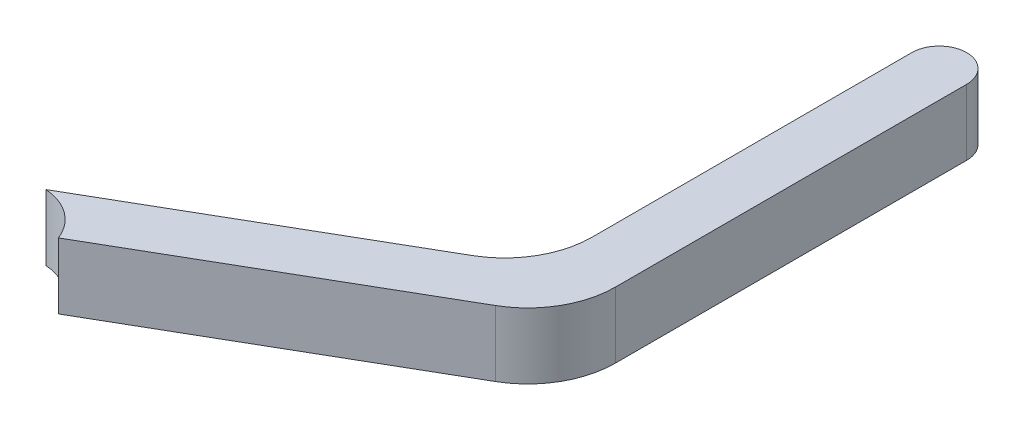
ISO-10303-21;
HEADER;
FILE_DESCRIPTION(('STEP AP214'),'2;1');
FILE_NAME('part.step','',(''),(''),'','','');
FILE_SCHEMA(('AUTOMOTIVE_DESIGN { 1 0 10303 214 1 1 1 1 }'));
ENDSEC;
DATA;
#1=APPLICATION_CONTEXT('core data for automotive mechanical design processes');
#2=APPLICATION_PROTOCOL_DEFINITION('international standard','automotive_design',2000,#1);
#3=PRODUCT_CONTEXT('',#1,'mechanical');
#4=PRODUCT('Part','Part','',(#3));
#5=PRODUCT_RELATED_PRODUCT_CATEGORY('part','',(#4));
#6=PRODUCT_DEFINITION_FORMATION('','',#4);
#7=PRODUCT_DEFINITION_CONTEXT('part definition',#1,'design');
#8=PRODUCT_DEFINITION('design','',#6,#7);
#9=PRODUCT_DEFINITION_SHAPE('','',#8);
#10=(LENGTH_UNIT() NAMED_UNIT(*) SI_UNIT(.MILLI.,.METRE.));
#11=(NAMED_UNIT(*) PLANE_ANGLE_UNIT() SI_UNIT($,.RADIAN.));
#12=(NAMED_UNIT(*) SI_UNIT($,.STERADIAN.) SOLID_ANGLE_UNIT());
#13=UNCERTAINTY_MEASURE_WITH_UNIT(LENGTH_MEASURE(1.E-05),#10,'distance_accuracy_value','');
#14=(GEOMETRIC_REPRESENTATION_CONTEXT(3) GLOBAL_UNCERTAINTY_ASSIGNED_CONTEXT((#13)) GLOBAL_UNIT_ASSIGNED_CONTEXT((#10,
#11,#12)) REPRESENTATION_CONTEXT('',''));
#15=CARTESIAN_POINT('',(0.,0.,0.));
#16=DIRECTION('',(0.,0.,1.));
#17=DIRECTION('',(1.,0.,0.));
#18=AXIS2_PLACEMENT_3D('',#15,#16,#17);
#19=CARTESIAN_POINT('',(-90.8935076670376,19.05,61.6428266425394));
#20=DIRECTION('',(-0.500000000000004,0.,-0.866025403784436));
#21=DIRECTION('',(-0.866025403784436,0.,0.500000000000004));
#22=AXIS2_PLACEMENT_3D('',#19,#20,#21);
#23=PLANE('',#22);
#24=DIRECTION('',(0.866025403784436,0.,-0.500000000000004));
#25=VECTOR('',#24,1.);
#26=CARTESIAN_POINT('',(-90.8935076670376,0.,61.6428266425394));
#27=LINE('',#26,#25);
#28=CARTESIAN_POINT('',(-84.9318322152041,0.,58.2008517156021));
#29=VERTEX_POINT('',#28);
#30=CARTESIAN_POINT('',(-4.76249999999986,0.,11.9150661804009));
#31=VERTEX_POINT('',#30);
#32=EDGE_CURVE('E159',#29,#31,#27,.T.);
#33=ORIENTED_EDGE('',*,*,#32,.T.);
#34=DIRECTION('',(0.,-1.,0.));
#35=VECTOR('',#34,1.);
#36=CARTESIAN_POINT('',(-4.76249999999986,19.05,11.9150661804009));
#37=LINE('',#36,#35);
#38=CARTESIAN_POINT('',(-4.76249999999986,19.05,11.9150661804009));
#39=VERTEX_POINT('',#38);
#40=EDGE_CURVE('E176',#31,#39,#37,.F.);
#41=ORIENTED_EDGE('',*,*,#40,.T.);
#42=DIRECTION('',(0.866025403784436,0.,-0.500000000000004));
#43=VECTOR('',#42,1.);
#44=CARTESIAN_POINT('',(-90.8935076670376,19.05,61.6428266425394));
#45=LINE('',#44,#43);
#46=CARTESIAN_POINT('',(-84.9318322152041,19.05,58.2008517156021));
#47=VERTEX_POINT('',#46);
#48=EDGE_CURVE('E147',#47,#39,#45,.T.);
#49=ORIENTED_EDGE('',*,*,#48,.F.);
#50=DIRECTION('',(0.,1.,0.));
#51=VECTOR('',#50,1.);
#52=CARTESIAN_POINT('',(-84.9318322152041,0.,58.2008517156021));
#53=LINE('',#52,#51);
#54=EDGE_CURVE('E134',#29,#47,#53,.T.);
#55=ORIENTED_EDGE('',*,*,#54,.F.);
#56=EDGE_LOOP('',(#33,#41,#49,#55));
#57=FACE_BOUND('',#56,.T.);
#58=ADVANCED_FACE('F33',(#57),#23,.F.);
#59=CARTESIAN_POINT('',(0.,19.05,-111.6203));
#60=DIRECTION('',(0.,-1.,0.));
#61=DIRECTION('',(0.,0.,-1.));
#62=AXIS2_PLACEMENT_3D('',#59,#60,#61);
#63=PLANE('',#62);
#64=ORIENTED_EDGE('',*,*,#48,.T.);
#65=CARTESIAN_POINT('',(-17.4625,19.05,-10.0819790757238));
#66=DIRECTION('',(0.,-1.,0.));
#67=DIRECTION('',(0.,0.,-1.));
#68=AXIS2_PLACEMENT_3D('',#65,#66,#67);
#69=CIRCLE('',#68,25.4);
#70=CARTESIAN_POINT('',(7.93750000000001,19.05,-10.0819790757238));
#71=VERTEX_POINT('',#70);
#72=EDGE_CURVE('E178',#39,#71,#69,.F.);
#73=ORIENTED_EDGE('',*,*,#72,.T.);
#74=DIRECTION('',(0.,0.,-1.));
#75=VECTOR('',#74,1.);
#76=CARTESIAN_POINT('',(7.9375,19.05,-111.6203));
#77=LINE('',#76,#75);
#78=CARTESIAN_POINT('',(7.9375,19.05,-111.6203));
#79=VERTEX_POINT('',#78);
#80=EDGE_CURVE('E150',#71,#79,#77,.T.);
#81=ORIENTED_EDGE('',*,*,#80,.T.);
#82=CARTESIAN_POINT('',(0.,19.05,-111.6203));
#83=DIRECTION('',(0.,1.,0.));
#84=DIRECTION('',(0.,0.,-1.));
#85=AXIS2_PLACEMENT_3D('',#82,#83,#84);
#86=CIRCLE('',#85,7.9375);
#87=CARTESIAN_POINT('',(-7.9375,19.05,-111.6203));
#88=VERTEX_POINT('',#87);
#89=EDGE_CURVE('E139',#79,#88,#86,.T.);
#90=ORIENTED_EDGE('',*,*,#89,.T.);
#91=DIRECTION('',(0.,0.,1.));
#92=VECTOR('',#91,1.);
#93=CARTESIAN_POINT('',(-7.9375,19.05,-111.6203));
#94=LINE('',#93,#92);
#95=CARTESIAN_POINT('',(-7.9375,19.05,-19.2474145991091));
#96=VERTEX_POINT('',#95);
#97=EDGE_CURVE('E142',#88,#96,#94,.T.);
#98=ORIENTED_EDGE('',*,*,#97,.T.);
#99=CARTESIAN_POINT('',(-33.3375,19.05,-19.2474145991091));
#100=DIRECTION('',(0.,-1.,0.));
#101=DIRECTION('',(0.,0.,-1.));
#102=AXIS2_PLACEMENT_3D('',#99,#100,#101);
#103=CIRCLE('',#102,25.4);
#104=CARTESIAN_POINT('',(-20.6374999999999,19.05,2.74963065701558));
#105=VERTEX_POINT('',#104);
#106=EDGE_CURVE('E11',#96,#105,#103,.T.);
#107=ORIENTED_EDGE('',*,*,#106,.T.);
#108=DIRECTION('',(-0.866025403784436,0.,0.500000000000005));
#109=VECTOR('',#108,1.);
#110=CARTESIAN_POINT('',(-98.8310076670377,19.05,47.8946733574615));
#111=LINE('',#110,#109);
#112=CARTESIAN_POINT('',(-98.8310076670377,19.05,47.8946733574615));
#113=VERTEX_POINT('',#112);
#114=EDGE_CURVE('E145',#105,#113,#111,.T.);
#115=ORIENTED_EDGE('',*,*,#114,.T.);
#116=CARTESIAN_POINT('',(-100.034341800716,19.05,64.0430012597286));
#117=DIRECTION('',(0.,1.,0.));
#118=DIRECTION('',(0.,0.,1.));
#119=AXIS2_PLACEMENT_3D('',#116,#117,#118);
#120=CIRCLE('',#119,16.1931006010712);
#121=EDGE_CURVE('E131',#113,#47,#120,.F.);
#122=ORIENTED_EDGE('',*,*,#121,.T.);
#123=EDGE_LOOP('',(#64,#73,#81,#90,#98,#107,#115,#122));
#124=FACE_BOUND('',#123,.T.);
#125=ADVANCED_FACE('F197',(#124),#63,.F.);
#126=CARTESIAN_POINT('',(0.,0.,-111.6203));
#127=DIRECTION('',(0.,-1.,0.));
#128=DIRECTION('',(0.,0.,-1.));
#129=AXIS2_PLACEMENT_3D('',#126,#127,#128);
#130=PLANE('',#129);
#131=CARTESIAN_POINT('',(0.,0.,-94.1578));
#132=DIRECTION('',(0.,-1.,0.));
#133=DIRECTION('',(0.,0.,-1.));
#134=AXIS2_PLACEMENT_3D('',#131,#132,#133);
#135=CIRCLE('',#134,1.58749999999999);
#136=CARTESIAN_POINT('',(0.,0.,-95.7453));
#137=VERTEX_POINT('',#136);
#138=EDGE_CURVE('E115',#137,#137,#135,.T.);
#139=ORIENTED_EDGE('',*,*,#138,.F.);
#140=EDGE_LOOP('',(#139));
#141=FACE_BOUND('',#140,.T.);
#142=CARTESIAN_POINT('',(-66.9035369590794,0.,38.6267750730631));
#143=DIRECTION('',(0.,-1.,0.));
#144=DIRECTION('',(0.,0.,-1.));
#145=AXIS2_PLACEMENT_3D('',#142,#143,#144);
#146=CIRCLE('',#145,1.58749999999999);
#147=CARTESIAN_POINT('',(-66.9035369590794,0.,37.0392750730631));
#148=VERTEX_POINT('',#147);
#149=EDGE_CURVE('E114',#148,#148,#146,.T.);
#150=ORIENTED_EDGE('',*,*,#149,.F.);
#151=EDGE_LOOP('',(#150));
#152=FACE_BOUND('',#151,.T.);
#153=CARTESIAN_POINT('',(-3.40295474387521,0.,-1.96469683741652));
#154=DIRECTION('',(0.,-1.,0.));
#155=DIRECTION('',(0.,0.,-1.));
#156=AXIS2_PLACEMENT_3D('',#153,#154,#155);
#157=CIRCLE('',#156,1.58749999999999);
#158=CARTESIAN_POINT('',(-3.40295474387521,0.,-3.55219683741651));
#159=VERTEX_POINT('',#158);
#160=EDGE_CURVE('E125',#159,#159,#157,.T.);
#161=ORIENTED_EDGE('',*,*,#160,.F.);
#162=EDGE_LOOP('',(#161));
#163=FACE_BOUND('',#162,.T.);
#164=DIRECTION('',(0.,0.,-1.));
#165=VECTOR('',#164,1.);
#166=CARTESIAN_POINT('',(7.9375,0.,-111.6203));
#167=LINE('',#166,#165);
#168=CARTESIAN_POINT('',(7.93750000000001,0.,-10.0819790757238));
#169=VERTEX_POINT('',#168);
#170=CARTESIAN_POINT('',(7.9375,0.,-111.6203));
#171=VERTEX_POINT('',#170);
#172=EDGE_CURVE('E143',#169,#171,#167,.T.);
#173=ORIENTED_EDGE('',*,*,#172,.F.);
#174=CARTESIAN_POINT('',(-17.4625,0.,-10.0819790757238));
#175=DIRECTION('',(0.,-1.,0.));
#176=DIRECTION('',(0.,0.,-1.));
#177=AXIS2_PLACEMENT_3D('',#174,#175,#176);
#178=CIRCLE('',#177,25.4);
#179=EDGE_CURVE('E174',#169,#31,#178,.T.);
#180=ORIENTED_EDGE('',*,*,#179,.T.);
#181=ORIENTED_EDGE('',*,*,#32,.F.);
#182=CARTESIAN_POINT('',(-100.034341800716,0.,64.0430012597286));
#183=DIRECTION('',(0.,1.,0.));
#184=DIRECTION('',(0.,0.,1.));
#185=AXIS2_PLACEMENT_3D('',#182,#183,#184);
#186=CIRCLE('',#185,16.1931006010712);
#187=CARTESIAN_POINT('',(-98.8310076670377,0.,47.8946733574615));
#188=VERTEX_POINT('',#187);
#189=EDGE_CURVE('E132',#188,#29,#186,.F.);
#190=ORIENTED_EDGE('',*,*,#189,.F.);
#191=DIRECTION('',(-0.866025403784436,0.,0.500000000000005));
#192=VECTOR('',#191,1.);
#193=CARTESIAN_POINT('',(-98.8310076670377,0.,47.8946733574615));
#194=LINE('',#193,#192);
#195=CARTESIAN_POINT('',(-20.6374999999999,0.,2.74963065701558));
#196=VERTEX_POINT('',#195);
#197=EDGE_CURVE('E157',#196,#188,#194,.T.);
#198=ORIENTED_EDGE('',*,*,#197,.F.);
#199=CARTESIAN_POINT('',(-33.3375,0.,-19.2474145991091));
#200=DIRECTION('',(0.,-1.,0.));
#201=DIRECTION('',(0.,0.,-1.));
#202=AXIS2_PLACEMENT_3D('',#199,#200,#201);
#203=CIRCLE('',#202,25.4);
#204=CARTESIAN_POINT('',(-7.9375,0.,-19.2474145991091));
#205=VERTEX_POINT('',#204);
#206=EDGE_CURVE('E41',#196,#205,#203,.F.);
#207=ORIENTED_EDGE('',*,*,#206,.T.);
#208=DIRECTION('',(0.,0.,1.));
#209=VECTOR('',#208,1.);
#210=CARTESIAN_POINT('',(-7.9375,0.,-111.6203));
#211=LINE('',#210,#209);
#212=CARTESIAN_POINT('',(-7.9375,0.,-111.6203));
#213=VERTEX_POINT('',#212);
#214=EDGE_CURVE('E155',#213,#205,#211,.T.);
#215=ORIENTED_EDGE('',*,*,#214,.F.);
#216=CARTESIAN_POINT('',(0.,0.,-111.6203));
#217=DIRECTION('',(0.,1.,0.));
#218=DIRECTION('',(0.,0.,-1.));
#219=AXIS2_PLACEMENT_3D('',#216,#217,#218);
#220=CIRCLE('',#219,7.9375);
#221=EDGE_CURVE('E138',#171,#213,#220,.T.);
#222=ORIENTED_EDGE('',*,*,#221,.F.);
#223=EDGE_LOOP('',(#173,#180,#181,#190,#198,#207,#215,#222));
#224=FACE_BOUND('',#223,.T.);
#225=ADVANCED_FACE('F186',(#141,#152,#163,#224),#130,.T.);
#226=CARTESIAN_POINT('',(0.,19.05,-111.6203));
#227=DIRECTION('',(0.,-1.,0.));
#228=DIRECTION('',(0.,0.,-1.));
#229=AXIS2_PLACEMENT_3D('',#226,#227,#228);
#230=CYLINDRICAL_SURFACE('',#229,7.9375);
#231=ORIENTED_EDGE('',*,*,#221,.T.);
#232=DIRECTION('',(0.,-1.,0.));
#233=VECTOR('',#232,1.);
#234=CARTESIAN_POINT('',(-7.9375,19.05,-111.6203));
#235=LINE('',#234,#233);
#236=EDGE_CURVE('E168',#88,#213,#235,.T.);
#237=ORIENTED_EDGE('',*,*,#236,.F.);
#238=ORIENTED_EDGE('',*,*,#89,.F.);
#239=DIRECTION('',(0.,-1.,0.));
#240=VECTOR('',#239,1.);
#241=CARTESIAN_POINT('',(7.9375,19.05,-111.6203));
#242=LINE('',#241,#240);
#243=EDGE_CURVE('E152',#79,#171,#242,.T.);
#244=ORIENTED_EDGE('',*,*,#243,.T.);
#245=EDGE_LOOP('',(#231,#237,#238,#244));
#246=FACE_BOUND('',#245,.T.);
#247=ADVANCED_FACE('F215',(#246),#230,.T.);
#248=CARTESIAN_POINT('',(-7.9375,19.05,-111.6203));
#249=DIRECTION('',(1.,0.,0.));
#250=DIRECTION('',(0.,0.,-1.));
#251=AXIS2_PLACEMENT_3D('',#248,#249,#250);
#252=PLANE('',#251);
#253=ORIENTED_EDGE('',*,*,#214,.T.);
#254=DIRECTION('',(0.,-1.,0.));
#255=VECTOR('',#254,1.);
#256=CARTESIAN_POINT('',(-7.93750000000001,19.05,-19.2474145991091));
#257=LINE('',#256,#255);
#258=EDGE_CURVE('E54',#205,#96,#257,.F.);
#259=ORIENTED_EDGE('',*,*,#258,.T.);
#260=ORIENTED_EDGE('',*,*,#97,.F.);
#261=ORIENTED_EDGE('',*,*,#236,.T.);
#262=EDGE_LOOP('',(#253,#259,#260,#261));
#263=FACE_BOUND('',#262,.T.);
#264=ADVANCED_FACE('F191',(#263),#252,.F.);
#265=CARTESIAN_POINT('',(-98.8310076670377,19.05,47.8946733574615));
#266=DIRECTION('',(0.500000000000005,0.,0.866025403784436));
#267=DIRECTION('',(0.866025403784436,0.,-0.500000000000005));
#268=AXIS2_PLACEMENT_3D('',#265,#266,#267);
#269=PLANE('',#268);
#270=ORIENTED_EDGE('',*,*,#114,.F.);
#271=DIRECTION('',(0.,-1.,0.));
#272=VECTOR('',#271,1.);
#273=CARTESIAN_POINT('',(-20.6374999999999,0.,2.74963065701558));
#274=LINE('',#273,#272);
#275=EDGE_CURVE('E180',#105,#196,#274,.T.);
#276=ORIENTED_EDGE('',*,*,#275,.T.);
#277=ORIENTED_EDGE('',*,*,#197,.T.);
#278=DIRECTION('',(0.,-1.,0.));
#279=VECTOR('',#278,1.);
#280=CARTESIAN_POINT('',(-98.8310076670377,19.05,47.8946733574615));
#281=LINE('',#280,#279);
#282=EDGE_CURVE('E165',#113,#188,#281,.T.);
#283=ORIENTED_EDGE('',*,*,#282,.F.);
#284=EDGE_LOOP('',(#270,#276,#277,#283));
#285=FACE_BOUND('',#284,.T.);
#286=ADVANCED_FACE('F194',(#285),#269,.F.);
#287=CARTESIAN_POINT('',(7.9375,19.05,-111.6203));
#288=DIRECTION('',(-1.,0.,0.));
#289=DIRECTION('',(0.,0.,1.));
#290=AXIS2_PLACEMENT_3D('',#287,#288,#289);
#291=PLANE('',#290);
#292=ORIENTED_EDGE('',*,*,#80,.F.);
#293=DIRECTION('',(0.,-1.,0.));
#294=VECTOR('',#293,1.);
#295=CARTESIAN_POINT('',(7.93750000000001,19.05,-10.0819790757238));
#296=LINE('',#295,#294);
#297=EDGE_CURVE('E171',#71,#169,#296,.T.);
#298=ORIENTED_EDGE('',*,*,#297,.T.);
#299=ORIENTED_EDGE('',*,*,#172,.T.);
#300=ORIENTED_EDGE('',*,*,#243,.F.);
#301=EDGE_LOOP('',(#292,#298,#299,#300));
#302=FACE_BOUND('',#301,.T.);
#303=ADVANCED_FACE('F211',(#302),#291,.F.);
#304=CARTESIAN_POINT('',(-100.034341800716,0.,64.0430012597286));
#305=DIRECTION('',(0.,1.,0.));
#306=DIRECTION('',(0.,0.,1.));
#307=AXIS2_PLACEMENT_3D('',#304,#305,#306);
#308=CYLINDRICAL_SURFACE('',#307,16.1931006010712);
#309=ORIENTED_EDGE('',*,*,#121,.F.);
#310=ORIENTED_EDGE('',*,*,#282,.T.);
#311=ORIENTED_EDGE('',*,*,#189,.T.);
#312=ORIENTED_EDGE('',*,*,#54,.T.);
#313=EDGE_LOOP('',(#309,#310,#311,#312));
#314=FACE_BOUND('',#313,.T.);
#315=ADVANCED_FACE('F200',(#314),#308,.F.);
#316=CARTESIAN_POINT('',(-17.4625,19.05,-10.0819790757238));
#317=DIRECTION('',(0.,-1.,0.));
#318=DIRECTION('',(0.,0.,-1.));
#319=AXIS2_PLACEMENT_3D('',#316,#317,#318);
#320=CYLINDRICAL_SURFACE('',#319,25.4);
#321=ORIENTED_EDGE('',*,*,#72,.F.);
#322=ORIENTED_EDGE('',*,*,#40,.F.);
#323=ORIENTED_EDGE('',*,*,#179,.F.);
#324=ORIENTED_EDGE('',*,*,#297,.F.);
#325=EDGE_LOOP('',(#321,#322,#323,#324));
#326=FACE_BOUND('',#325,.T.);
#327=ADVANCED_FACE('F208',(#326),#320,.T.);
#328=CARTESIAN_POINT('',(-33.3375,19.05,-19.2474145991091));
#329=DIRECTION('',(0.,1.,0.));
#330=DIRECTION('',(0.,0.,1.));
#331=AXIS2_PLACEMENT_3D('',#328,#329,#330);
#332=CYLINDRICAL_SURFACE('',#331,25.4);
#333=ORIENTED_EDGE('',*,*,#106,.F.);
#334=ORIENTED_EDGE('',*,*,#258,.F.);
#335=ORIENTED_EDGE('',*,*,#206,.F.);
#336=ORIENTED_EDGE('',*,*,#275,.F.);
#337=EDGE_LOOP('',(#333,#334,#335,#336));
#338=FACE_BOUND('',#337,.T.);
#339=ADVANCED_FACE('F35',(#338),#332,.F.);
#340=CARTESIAN_POINT('',(-3.40295474387521,11.1252,-1.96469683741652));
#341=DIRECTION('',(0.,-1.,0.));
#342=DIRECTION('',(0.,0.,-1.));
#343=AXIS2_PLACEMENT_3D('',#340,#341,#342);
#344=CONICAL_SURFACE('',#343,1.58749999999999,1.02974425867665);
#345=CARTESIAN_POINT('',(-3.40295474387521,12.0790662327063,-1.96469683741652));
#346=VERTEX_POINT('',#345);
#347=VERTEX_LOOP('',#346);
#348=FACE_BOUND('',#347,.T.);
#349=CARTESIAN_POINT('',(-3.40295474387521,11.1252,-1.96469683741652));
#350=DIRECTION('',(0.,-1.,0.));
#351=DIRECTION('',(0.,0.,-1.));
#352=AXIS2_PLACEMENT_3D('',#349,#350,#351);
#353=CIRCLE('',#352,1.58749999999999);
#354=CARTESIAN_POINT('',(-3.40295474387521,11.1252,-3.5521968374165));
#355=VERTEX_POINT('',#354);
#356=EDGE_CURVE('E128',#355,#355,#353,.T.);
#357=ORIENTED_EDGE('',*,*,#356,.T.);
#358=EDGE_LOOP('',(#357));
#359=FACE_BOUND('',#358,.T.);
#360=ADVANCED_FACE('F246',(#348,#359),#344,.F.);
#361=CARTESIAN_POINT('',(-3.40295474387521,0.,-1.96469683741652));
#362=DIRECTION('',(0.,-1.,0.));
#363=DIRECTION('',(0.,0.,-1.));
#364=AXIS2_PLACEMENT_3D('',#361,#362,#363);
#365=CYLINDRICAL_SURFACE('',#364,1.58749999999999);
#366=ORIENTED_EDGE('',*,*,#356,.F.);
#367=EDGE_LOOP('',(#366));
#368=FACE_BOUND('',#367,.T.);
#369=ORIENTED_EDGE('',*,*,#160,.T.);
#370=EDGE_LOOP('',(#369));
#371=FACE_BOUND('',#370,.T.);
#372=ADVANCED_FACE('F249',(#368,#371),#365,.F.);
#373=CARTESIAN_POINT('',(-66.9035369590794,11.1252,38.6267750730631));
#374=DIRECTION('',(0.,-1.,0.));
#375=DIRECTION('',(0.,0.,-1.));
#376=AXIS2_PLACEMENT_3D('',#373,#374,#375);
#377=CONICAL_SURFACE('',#376,1.58749999999999,1.02974425867665);
#378=CARTESIAN_POINT('',(-66.9035369590794,12.0790662327063,38.6267750730631));
#379=VERTEX_POINT('',#378);
#380=VERTEX_LOOP('',#379);
#381=FACE_BOUND('',#380,.T.);
#382=CARTESIAN_POINT('',(-66.9035369590794,11.1252,38.6267750730631));
#383=DIRECTION('',(0.,-1.,0.));
#384=DIRECTION('',(0.,0.,-1.));
#385=AXIS2_PLACEMENT_3D('',#382,#383,#384);
#386=CIRCLE('',#385,1.58749999999999);
#387=CARTESIAN_POINT('',(-66.9035369590794,11.1252,37.0392750730631));
#388=VERTEX_POINT('',#387);
#389=EDGE_CURVE('E118',#388,#388,#386,.T.);
#390=ORIENTED_EDGE('',*,*,#389,.T.);
#391=EDGE_LOOP('',(#390));
#392=FACE_BOUND('',#391,.T.);
#393=ADVANCED_FACE('F253',(#381,#392),#377,.F.);
#394=CARTESIAN_POINT('',(-66.9035369590794,0.,38.6267750730631));
#395=DIRECTION('',(0.,-1.,0.));
#396=DIRECTION('',(0.,0.,-1.));
#397=AXIS2_PLACEMENT_3D('',#394,#395,#396);
#398=CYLINDRICAL_SURFACE('',#397,1.58749999999999);
#399=ORIENTED_EDGE('',*,*,#389,.F.);
#400=EDGE_LOOP('',(#399));
#401=FACE_BOUND('',#400,.T.);
#402=ORIENTED_EDGE('',*,*,#149,.T.);
#403=EDGE_LOOP('',(#402));
#404=FACE_BOUND('',#403,.T.);
#405=ADVANCED_FACE('F108',(#401,#404),#398,.F.);
#406=CARTESIAN_POINT('',(0.,11.1252,-94.1578));
#407=DIRECTION('',(0.,-1.,0.));
#408=DIRECTION('',(0.,0.,-1.));
#409=AXIS2_PLACEMENT_3D('',#406,#407,#408);
#410=CONICAL_SURFACE('',#409,1.58749999999999,1.02974425867665);
#411=CARTESIAN_POINT('',(0.,12.0790662327063,-94.1578));
#412=VERTEX_POINT('',#411);
#413=VERTEX_LOOP('',#412);
#414=FACE_BOUND('',#413,.T.);
#415=CARTESIAN_POINT('',(0.,11.1252,-94.1578));
#416=DIRECTION('',(0.,-1.,0.));
#417=DIRECTION('',(0.,0.,-1.));
#418=AXIS2_PLACEMENT_3D('',#415,#416,#417);
#419=CIRCLE('',#418,1.58749999999999);
#420=CARTESIAN_POINT('',(0.,11.1252,-95.7453));
#421=VERTEX_POINT('',#420);
#422=EDGE_CURVE('E112',#421,#421,#419,.T.);
#423=ORIENTED_EDGE('',*,*,#422,.T.);
#424=EDGE_LOOP('',(#423));
#425=FACE_BOUND('',#424,.T.);
#426=ADVANCED_FACE('F104',(#414,#425),#410,.F.);
#427=CARTESIAN_POINT('',(0.,0.,-94.1578));
#428=DIRECTION('',(0.,-1.,0.));
#429=DIRECTION('',(0.,0.,-1.));
#430=AXIS2_PLACEMENT_3D('',#427,#428,#429);
#431=CYLINDRICAL_SURFACE('',#430,1.58749999999999);
#432=ORIENTED_EDGE('',*,*,#422,.F.);
#433=EDGE_LOOP('',(#432));
#434=FACE_BOUND('',#433,.T.);
#435=ORIENTED_EDGE('',*,*,#138,.T.);
#436=EDGE_LOOP('',(#435));
#437=FACE_BOUND('',#436,.T.);
#438=ADVANCED_FACE('F107',(#434,#437),#431,.F.);
#439=CLOSED_SHELL('',(#58,#125,#225,#247,#264,#286,#303,#315,#327,#339,#360,#372,#393,#405,#426,#438));
#440=MANIFOLD_SOLID_BREP('B2',#439);
#441=ADVANCED_BREP_SHAPE_REPRESENTATION('',(#18,#440),#14);
#442=SHAPE_DEFINITION_REPRESENTATION(#9,#441);
ENDSEC;
END-ISO-10303-21;
